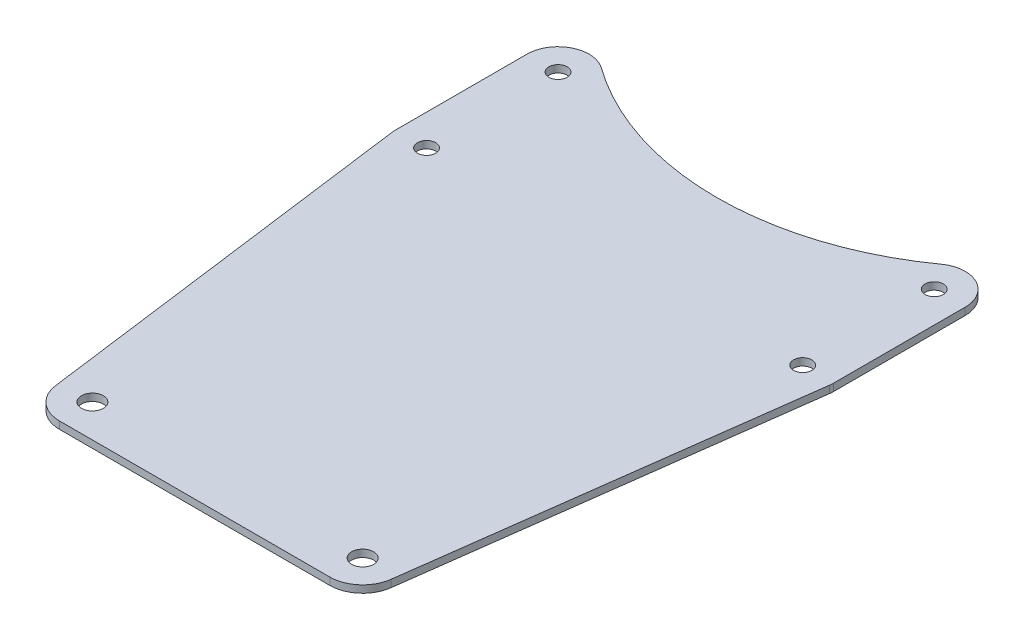
ISO-10303-21;
HEADER;
FILE_DESCRIPTION(('STEP AP214'),'2;1');
FILE_NAME('part.step','',(''),(''),'','','');
FILE_SCHEMA(('AUTOMOTIVE_DESIGN { 1 0 10303 214 1 1 1 1 }'));
ENDSEC;
DATA;
#1=APPLICATION_CONTEXT('core data for automotive mechanical design processes');
#2=APPLICATION_PROTOCOL_DEFINITION('international standard','automotive_design',2000,#1);
#3=PRODUCT_CONTEXT('',#1,'mechanical');
#4=PRODUCT('Part','Part','',(#3));
#5=PRODUCT_RELATED_PRODUCT_CATEGORY('part','',(#4));
#6=PRODUCT_DEFINITION_FORMATION('','',#4);
#7=PRODUCT_DEFINITION_CONTEXT('part definition',#1,'design');
#8=PRODUCT_DEFINITION('design','',#6,#7);
#9=PRODUCT_DEFINITION_SHAPE('','',#8);
#10=(LENGTH_UNIT() NAMED_UNIT(*) SI_UNIT(.MILLI.,.METRE.));
#11=(NAMED_UNIT(*) PLANE_ANGLE_UNIT() SI_UNIT($,.RADIAN.));
#12=(NAMED_UNIT(*) SI_UNIT($,.STERADIAN.) SOLID_ANGLE_UNIT());
#13=UNCERTAINTY_MEASURE_WITH_UNIT(LENGTH_MEASURE(1.E-05),#10,'distance_accuracy_value','');
#14=(GEOMETRIC_REPRESENTATION_CONTEXT(3) GLOBAL_UNCERTAINTY_ASSIGNED_CONTEXT((#13)) GLOBAL_UNIT_ASSIGNED_CONTEXT((#10,
#11,#12)) REPRESENTATION_CONTEXT('',''));
#15=CARTESIAN_POINT('',(0.,0.,0.));
#16=DIRECTION('',(0.,0.,1.));
#17=DIRECTION('',(1.,0.,0.));
#18=AXIS2_PLACEMENT_3D('',#15,#16,#17);
#19=CARTESIAN_POINT('',(-18.5,0.5,62.));
#20=DIRECTION('',(0.,1.,0.));
#21=DIRECTION('',(0.,0.,1.));
#22=AXIS2_PLACEMENT_3D('',#19,#20,#21);
#23=PLANE('',#22);
#24=CARTESIAN_POINT('',(18.5,0.5,62.));
#25=DIRECTION('',(0.,1.,0.));
#26=DIRECTION('',(0.,0.,1.));
#27=AXIS2_PLACEMENT_3D('',#24,#25,#26);
#28=CIRCLE('',#27,1.5);
#29=CARTESIAN_POINT('',(18.5,0.5,63.5));
#30=VERTEX_POINT('',#29);
#31=EDGE_CURVE('E300',#30,#30,#28,.T.);
#32=ORIENTED_EDGE('',*,*,#31,.F.);
#33=EDGE_LOOP('',(#32));
#34=FACE_BOUND('',#33,.T.);
#35=CARTESIAN_POINT('',(25.75,0.5,-9.));
#36=DIRECTION('',(0.,1.,0.));
#37=DIRECTION('',(0.,0.,1.));
#38=AXIS2_PLACEMENT_3D('',#35,#36,#37);
#39=CIRCLE('',#38,1.25);
#40=CARTESIAN_POINT('',(25.75,0.5,-7.75));
#41=VERTEX_POINT('',#40);
#42=EDGE_CURVE('E312',#41,#41,#39,.T.);
#43=ORIENTED_EDGE('',*,*,#42,.F.);
#44=EDGE_LOOP('',(#43));
#45=FACE_BOUND('',#44,.T.);
#46=CARTESIAN_POINT('',(-18.5,0.5,62.));
#47=DIRECTION('',(0.,1.,0.));
#48=DIRECTION('',(0.,0.,1.));
#49=AXIS2_PLACEMENT_3D('',#46,#47,#48);
#50=CIRCLE('',#49,1.5);
#51=CARTESIAN_POINT('',(-18.5,0.5,63.5));
#52=VERTEX_POINT('',#51);
#53=EDGE_CURVE('E158',#52,#52,#50,.T.);
#54=ORIENTED_EDGE('',*,*,#53,.F.);
#55=EDGE_LOOP('',(#54));
#56=FACE_BOUND('',#55,.T.);
#57=CARTESIAN_POINT('',(-18.5,0.5,62.));
#58=DIRECTION('',(0.,1.,0.));
#59=DIRECTION('',(0.,0.,1.));
#60=AXIS2_PLACEMENT_3D('',#57,#58,#59);
#61=CIRCLE('',#60,4.50000000000001);
#62=CARTESIAN_POINT('',(-22.961280999979,0.5,62.5890431556575));
#63=VERTEX_POINT('',#62);
#64=CARTESIAN_POINT('',(-18.5,0.5,66.5));
#65=VERTEX_POINT('',#64);
#66=EDGE_CURVE('E177',#63,#65,#61,.T.);
#67=ORIENTED_EDGE('',*,*,#66,.T.);
#68=DIRECTION('',(1.,0.,0.));
#69=VECTOR('',#68,1.);
#70=CARTESIAN_POINT('',(-18.5,0.5,66.5));
#71=LINE('',#70,#69);
#72=CARTESIAN_POINT('',(18.5,0.5,66.5));
#73=VERTEX_POINT('',#72);
#74=EDGE_CURVE('E105',#65,#73,#71,.T.);
#75=ORIENTED_EDGE('',*,*,#74,.T.);
#76=CARTESIAN_POINT('',(18.5,0.5,62.));
#77=DIRECTION('',(0.,1.,0.));
#78=DIRECTION('',(0.,0.,-1.));
#79=AXIS2_PLACEMENT_3D('',#76,#77,#78);
#80=CIRCLE('',#79,4.50000000000002);
#81=CARTESIAN_POINT('',(22.961280999979,0.5,62.5890431556575));
#82=VERTEX_POINT('',#81);
#83=EDGE_CURVE('E204',#73,#82,#80,.T.);
#84=ORIENTED_EDGE('',*,*,#83,.T.);
#85=DIRECTION('',(0.130898479034999,0.,-0.991395777773097));
#86=VECTOR('',#85,1.);
#87=CARTESIAN_POINT('',(29.9634320555357,0.5,9.55631853589878));
#88=LINE('',#87,#86);
#89=CARTESIAN_POINT('',(29.9634320555357,0.5,9.55631853589878));
#90=VERTEX_POINT('',#89);
#91=EDGE_CURVE('E223',#82,#90,#88,.T.);
#92=ORIENTED_EDGE('',*,*,#91,.T.);
#93=CARTESIAN_POINT('',(25.75,0.5,9.));
#94=DIRECTION('',(0.,1.,0.));
#95=DIRECTION('',(0.,0.,1.));
#96=AXIS2_PLACEMENT_3D('',#93,#94,#95);
#97=CIRCLE('',#96,4.24999999999999);
#98=CARTESIAN_POINT('',(30.,0.5,9.00000000000004));
#99=VERTEX_POINT('',#98);
#100=EDGE_CURVE('E220',#90,#99,#97,.T.);
#101=ORIENTED_EDGE('',*,*,#100,.T.);
#102=DIRECTION('',(0.,0.,-1.));
#103=VECTOR('',#102,1.);
#104=CARTESIAN_POINT('',(30.,0.5,9.00000000000004));
#105=LINE('',#104,#103);
#106=CARTESIAN_POINT('',(30.,0.5,-8.99999999999997));
#107=VERTEX_POINT('',#106);
#108=EDGE_CURVE('E222',#99,#107,#105,.T.);
#109=ORIENTED_EDGE('',*,*,#108,.T.);
#110=CARTESIAN_POINT('',(25.75,0.5,-9.));
#111=DIRECTION('',(0.,1.,0.));
#112=DIRECTION('',(0.,0.,1.));
#113=AXIS2_PLACEMENT_3D('',#110,#111,#112);
#114=CIRCLE('',#113,4.24999999999999);
#115=CARTESIAN_POINT('',(23.2768361581921,0.5,-12.4562929001423));
#116=VERTEX_POINT('',#115);
#117=EDGE_CURVE('E225',#107,#116,#114,.T.);
#118=ORIENTED_EDGE('',*,*,#117,.T.);
#119=CARTESIAN_POINT('',(0.,0.5,-44.9861084308931));
#120=DIRECTION('',(0.,-1.,0.));
#121=DIRECTION('',(0.,0.,-1.));
#122=AXIS2_PLACEMENT_3D('',#119,#120,#121);
#123=CIRCLE('',#122,40.);
#124=CARTESIAN_POINT('',(-23.2768361581921,0.5,-12.4562929001422));
#125=VERTEX_POINT('',#124);
#126=EDGE_CURVE('E231',#116,#125,#123,.T.);
#127=ORIENTED_EDGE('',*,*,#126,.T.);
#128=CARTESIAN_POINT('',(-25.75,0.5,-8.99999999999997));
#129=DIRECTION('',(0.,1.,0.));
#130=DIRECTION('',(0.,0.,-1.));
#131=AXIS2_PLACEMENT_3D('',#128,#129,#130);
#132=CIRCLE('',#131,4.25);
#133=CARTESIAN_POINT('',(-30.,0.5,-8.99999999999997));
#134=VERTEX_POINT('',#133);
#135=EDGE_CURVE('E136',#125,#134,#132,.T.);
#136=ORIENTED_EDGE('',*,*,#135,.T.);
#137=DIRECTION('',(0.,0.,1.));
#138=VECTOR('',#137,1.);
#139=CARTESIAN_POINT('',(-30.,0.5,9.00000000000004));
#140=LINE('',#139,#138);
#141=CARTESIAN_POINT('',(-30.,0.5,9.00000000000004));
#142=VERTEX_POINT('',#141);
#143=EDGE_CURVE('E130',#134,#142,#140,.T.);
#144=ORIENTED_EDGE('',*,*,#143,.T.);
#145=CARTESIAN_POINT('',(-25.75,0.5,9.00000000000004));
#146=DIRECTION('',(0.,1.,0.));
#147=DIRECTION('',(0.,0.,-1.));
#148=AXIS2_PLACEMENT_3D('',#145,#146,#147);
#149=CIRCLE('',#148,4.25);
#150=CARTESIAN_POINT('',(-29.9634320555357,0.5,9.55631853589878));
#151=VERTEX_POINT('',#150);
#152=EDGE_CURVE('E134',#142,#151,#149,.T.);
#153=ORIENTED_EDGE('',*,*,#152,.T.);
#154=DIRECTION('',(0.130898479034999,0.,0.991395777773097));
#155=VECTOR('',#154,1.);
#156=CARTESIAN_POINT('',(-29.9634320555357,0.5,9.55631853589878));
#157=LINE('',#156,#155);
#158=EDGE_CURVE('E50',#151,#63,#157,.T.);
#159=ORIENTED_EDGE('',*,*,#158,.T.);
#160=EDGE_LOOP('',(#67,#75,#84,#92,#101,#109,#118,#127,#136,#144,#153,#159));
#161=FACE_BOUND('',#160,.T.);
#162=CARTESIAN_POINT('',(-25.75,0.5,-8.99999999999997));
#163=DIRECTION('',(0.,1.,0.));
#164=DIRECTION('',(0.,0.,1.));
#165=AXIS2_PLACEMENT_3D('',#162,#163,#164);
#166=CIRCLE('',#165,1.25000000000001);
#167=CARTESIAN_POINT('',(-25.75,0.5,-7.74999999999996));
#168=VERTEX_POINT('',#167);
#169=EDGE_CURVE('E318',#168,#168,#166,.T.);
#170=ORIENTED_EDGE('',*,*,#169,.F.);
#171=EDGE_LOOP('',(#170));
#172=FACE_BOUND('',#171,.T.);
#173=CARTESIAN_POINT('',(25.75,0.5,9.));
#174=DIRECTION('',(0.,1.,0.));
#175=DIRECTION('',(0.,0.,1.));
#176=AXIS2_PLACEMENT_3D('',#173,#174,#175);
#177=CIRCLE('',#176,1.25);
#178=CARTESIAN_POINT('',(25.75,0.5,10.25));
#179=VERTEX_POINT('',#178);
#180=EDGE_CURVE('E306',#179,#179,#177,.T.);
#181=ORIENTED_EDGE('',*,*,#180,.F.);
#182=EDGE_LOOP('',(#181));
#183=FACE_BOUND('',#182,.T.);
#184=CARTESIAN_POINT('',(-25.75,0.5,9.00000000000004));
#185=DIRECTION('',(0.,1.,0.));
#186=DIRECTION('',(0.,0.,1.));
#187=AXIS2_PLACEMENT_3D('',#184,#185,#186);
#188=CIRCLE('',#187,1.25);
#189=CARTESIAN_POINT('',(-25.75,0.5,10.25));
#190=VERTEX_POINT('',#189);
#191=EDGE_CURVE('E291',#190,#190,#188,.T.);
#192=ORIENTED_EDGE('',*,*,#191,.F.);
#193=EDGE_LOOP('',(#192));
#194=FACE_BOUND('',#193,.T.);
#195=ADVANCED_FACE('F33',(#34,#45,#56,#161,#172,#183,#194),#23,.T.);
#196=CARTESIAN_POINT('',(-18.5,-0.5,62.));
#197=DIRECTION('',(0.,1.,0.));
#198=DIRECTION('',(0.,0.,1.));
#199=AXIS2_PLACEMENT_3D('',#196,#197,#198);
#200=PLANE('',#199);
#201=CARTESIAN_POINT('',(18.5,-0.5,62.));
#202=DIRECTION('',(0.,1.,0.));
#203=DIRECTION('',(0.,0.,1.));
#204=AXIS2_PLACEMENT_3D('',#201,#202,#203);
#205=CIRCLE('',#204,1.5);
#206=CARTESIAN_POINT('',(18.5,-0.5,63.5));
#207=VERTEX_POINT('',#206);
#208=EDGE_CURVE('E297',#207,#207,#205,.T.);
#209=ORIENTED_EDGE('',*,*,#208,.T.);
#210=EDGE_LOOP('',(#209));
#211=FACE_BOUND('',#210,.T.);
#212=CARTESIAN_POINT('',(25.75,-0.5,-9.));
#213=DIRECTION('',(0.,1.,0.));
#214=DIRECTION('',(0.,0.,1.));
#215=AXIS2_PLACEMENT_3D('',#212,#213,#214);
#216=CIRCLE('',#215,1.25);
#217=CARTESIAN_POINT('',(25.75,-0.5,-7.75));
#218=VERTEX_POINT('',#217);
#219=EDGE_CURVE('E309',#218,#218,#216,.T.);
#220=ORIENTED_EDGE('',*,*,#219,.T.);
#221=EDGE_LOOP('',(#220));
#222=FACE_BOUND('',#221,.T.);
#223=CARTESIAN_POINT('',(-18.5,-0.5,62.));
#224=DIRECTION('',(0.,1.,0.));
#225=DIRECTION('',(0.,0.,1.));
#226=AXIS2_PLACEMENT_3D('',#223,#224,#225);
#227=CIRCLE('',#226,1.5);
#228=CARTESIAN_POINT('',(-18.5,-0.5,63.5));
#229=VERTEX_POINT('',#228);
#230=EDGE_CURVE('E321',#229,#229,#227,.T.);
#231=ORIENTED_EDGE('',*,*,#230,.T.);
#232=EDGE_LOOP('',(#231));
#233=FACE_BOUND('',#232,.T.);
#234=CARTESIAN_POINT('',(-18.5,-0.5,62.));
#235=DIRECTION('',(0.,1.,0.));
#236=DIRECTION('',(0.,0.,1.));
#237=AXIS2_PLACEMENT_3D('',#234,#235,#236);
#238=CIRCLE('',#237,4.50000000000001);
#239=CARTESIAN_POINT('',(-22.961280999979,-0.5,62.5890431556575));
#240=VERTEX_POINT('',#239);
#241=CARTESIAN_POINT('',(-18.5,-0.5,66.5));
#242=VERTEX_POINT('',#241);
#243=EDGE_CURVE('E154',#240,#242,#238,.T.);
#244=ORIENTED_EDGE('',*,*,#243,.F.);
#245=DIRECTION('',(0.130898479034999,0.,0.991395777773097));
#246=VECTOR('',#245,1.);
#247=CARTESIAN_POINT('',(-29.9634320555357,-0.5,9.55631853589878));
#248=LINE('',#247,#246);
#249=CARTESIAN_POINT('',(-29.9634320555357,-0.5,9.55631853589878));
#250=VERTEX_POINT('',#249);
#251=EDGE_CURVE('E97',#250,#240,#248,.T.);
#252=ORIENTED_EDGE('',*,*,#251,.F.);
#253=CARTESIAN_POINT('',(-25.75,-0.5,9.00000000000004));
#254=DIRECTION('',(0.,1.,0.));
#255=DIRECTION('',(0.,0.,-1.));
#256=AXIS2_PLACEMENT_3D('',#253,#254,#255);
#257=CIRCLE('',#256,4.25);
#258=CARTESIAN_POINT('',(-30.,-0.5,9.00000000000004));
#259=VERTEX_POINT('',#258);
#260=EDGE_CURVE('E91',#259,#250,#257,.T.);
#261=ORIENTED_EDGE('',*,*,#260,.F.);
#262=DIRECTION('',(0.,0.,1.));
#263=VECTOR('',#262,1.);
#264=CARTESIAN_POINT('',(-30.,-0.5,9.00000000000004));
#265=LINE('',#264,#263);
#266=CARTESIAN_POINT('',(-30.,-0.5,-8.99999999999997));
#267=VERTEX_POINT('',#266);
#268=EDGE_CURVE('E144',#267,#259,#265,.T.);
#269=ORIENTED_EDGE('',*,*,#268,.F.);
#270=CARTESIAN_POINT('',(-25.75,-0.5,-8.99999999999997));
#271=DIRECTION('',(0.,1.,0.));
#272=DIRECTION('',(0.,0.,-1.));
#273=AXIS2_PLACEMENT_3D('',#270,#271,#272);
#274=CIRCLE('',#273,4.25);
#275=CARTESIAN_POINT('',(-23.2768361581921,-0.5,-12.4562929001422));
#276=VERTEX_POINT('',#275);
#277=EDGE_CURVE('E172',#276,#267,#274,.T.);
#278=ORIENTED_EDGE('',*,*,#277,.F.);
#279=CARTESIAN_POINT('',(0.,-0.5,-44.9861084308931));
#280=DIRECTION('',(0.,-1.,0.));
#281=DIRECTION('',(0.,0.,-1.));
#282=AXIS2_PLACEMENT_3D('',#279,#280,#281);
#283=CIRCLE('',#282,40.);
#284=CARTESIAN_POINT('',(23.2768361581921,-0.5,-12.4562929001423));
#285=VERTEX_POINT('',#284);
#286=EDGE_CURVE('E170',#285,#276,#283,.T.);
#287=ORIENTED_EDGE('',*,*,#286,.F.);
#288=CARTESIAN_POINT('',(25.75,-0.5,-9.));
#289=DIRECTION('',(0.,1.,0.));
#290=DIRECTION('',(0.,0.,1.));
#291=AXIS2_PLACEMENT_3D('',#288,#289,#290);
#292=CIRCLE('',#291,4.24999999999999);
#293=CARTESIAN_POINT('',(30.,-0.5,-8.99999999999997));
#294=VERTEX_POINT('',#293);
#295=EDGE_CURVE('E168',#294,#285,#292,.T.);
#296=ORIENTED_EDGE('',*,*,#295,.F.);
#297=DIRECTION('',(0.,0.,-1.));
#298=VECTOR('',#297,1.);
#299=CARTESIAN_POINT('',(30.,-0.5,9.00000000000004));
#300=LINE('',#299,#298);
#301=CARTESIAN_POINT('',(30.,-0.5,9.00000000000004));
#302=VERTEX_POINT('',#301);
#303=EDGE_CURVE('E166',#302,#294,#300,.T.);
#304=ORIENTED_EDGE('',*,*,#303,.F.);
#305=CARTESIAN_POINT('',(25.75,-0.5,9.));
#306=DIRECTION('',(0.,1.,0.));
#307=DIRECTION('',(0.,0.,1.));
#308=AXIS2_PLACEMENT_3D('',#305,#306,#307);
#309=CIRCLE('',#308,4.24999999999999);
#310=CARTESIAN_POINT('',(29.9634320555357,-0.5,9.55631853589878));
#311=VERTEX_POINT('',#310);
#312=EDGE_CURVE('E164',#311,#302,#309,.T.);
#313=ORIENTED_EDGE('',*,*,#312,.F.);
#314=DIRECTION('',(0.130898479034999,0.,-0.991395777773097));
#315=VECTOR('',#314,1.);
#316=CARTESIAN_POINT('',(29.9634320555357,-0.5,9.55631853589878));
#317=LINE('',#316,#315);
#318=CARTESIAN_POINT('',(22.961280999979,-0.5,62.5890431556575));
#319=VERTEX_POINT('',#318);
#320=EDGE_CURVE('E162',#319,#311,#317,.T.);
#321=ORIENTED_EDGE('',*,*,#320,.F.);
#322=CARTESIAN_POINT('',(18.5,-0.5,62.));
#323=DIRECTION('',(0.,1.,0.));
#324=DIRECTION('',(0.,0.,-1.));
#325=AXIS2_PLACEMENT_3D('',#322,#323,#324);
#326=CIRCLE('',#325,4.50000000000002);
#327=CARTESIAN_POINT('',(18.5,-0.5,66.5));
#328=VERTEX_POINT('',#327);
#329=EDGE_CURVE('E160',#328,#319,#326,.T.);
#330=ORIENTED_EDGE('',*,*,#329,.F.);
#331=DIRECTION('',(1.,0.,0.));
#332=VECTOR('',#331,1.);
#333=CARTESIAN_POINT('',(-18.5,-0.5,66.5));
#334=LINE('',#333,#332);
#335=EDGE_CURVE('E157',#242,#328,#334,.T.);
#336=ORIENTED_EDGE('',*,*,#335,.F.);
#337=EDGE_LOOP('',(#244,#252,#261,#269,#278,#287,#296,#304,#313,#321,#330,#336));
#338=FACE_BOUND('',#337,.T.);
#339=CARTESIAN_POINT('',(-25.75,-0.5,-8.99999999999997));
#340=DIRECTION('',(0.,1.,0.));
#341=DIRECTION('',(0.,0.,1.));
#342=AXIS2_PLACEMENT_3D('',#339,#340,#341);
#343=CIRCLE('',#342,1.25000000000001);
#344=CARTESIAN_POINT('',(-25.75,-0.5,-7.74999999999996));
#345=VERTEX_POINT('',#344);
#346=EDGE_CURVE('E315',#345,#345,#343,.T.);
#347=ORIENTED_EDGE('',*,*,#346,.T.);
#348=EDGE_LOOP('',(#347));
#349=FACE_BOUND('',#348,.T.);
#350=CARTESIAN_POINT('',(25.75,-0.5,9.));
#351=DIRECTION('',(0.,1.,0.));
#352=DIRECTION('',(0.,0.,1.));
#353=AXIS2_PLACEMENT_3D('',#350,#351,#352);
#354=CIRCLE('',#353,1.25);
#355=CARTESIAN_POINT('',(25.75,-0.5,10.25));
#356=VERTEX_POINT('',#355);
#357=EDGE_CURVE('E303',#356,#356,#354,.T.);
#358=ORIENTED_EDGE('',*,*,#357,.T.);
#359=EDGE_LOOP('',(#358));
#360=FACE_BOUND('',#359,.T.);
#361=CARTESIAN_POINT('',(-25.75,-0.5,9.00000000000004));
#362=DIRECTION('',(0.,1.,0.));
#363=DIRECTION('',(0.,0.,1.));
#364=AXIS2_PLACEMENT_3D('',#361,#362,#363);
#365=CIRCLE('',#364,1.25);
#366=CARTESIAN_POINT('',(-25.75,-0.5,10.25));
#367=VERTEX_POINT('',#366);
#368=EDGE_CURVE('E294',#367,#367,#365,.T.);
#369=ORIENTED_EDGE('',*,*,#368,.T.);
#370=EDGE_LOOP('',(#369));
#371=FACE_BOUND('',#370,.T.);
#372=ADVANCED_FACE('F208',(#211,#222,#233,#338,#349,#360,#371),#200,.F.);
#373=CARTESIAN_POINT('',(-18.5,0.5,62.));
#374=DIRECTION('',(0.,-1.,0.));
#375=DIRECTION('',(0.,0.,-1.));
#376=AXIS2_PLACEMENT_3D('',#373,#374,#375);
#377=CYLINDRICAL_SURFACE('',#376,4.50000000000001);
#378=ORIENTED_EDGE('',*,*,#243,.T.);
#379=DIRECTION('',(0.,-1.,0.));
#380=VECTOR('',#379,1.);
#381=CARTESIAN_POINT('',(-18.5,0.5,66.5));
#382=LINE('',#381,#380);
#383=EDGE_CURVE('E11',#65,#242,#382,.T.);
#384=ORIENTED_EDGE('',*,*,#383,.F.);
#385=ORIENTED_EDGE('',*,*,#66,.F.);
#386=DIRECTION('',(0.,-1.,0.));
#387=VECTOR('',#386,1.);
#388=CARTESIAN_POINT('',(-22.961280999979,0.5,62.5890431556575));
#389=LINE('',#388,#387);
#390=EDGE_CURVE('E150',#63,#240,#389,.T.);
#391=ORIENTED_EDGE('',*,*,#390,.T.);
#392=EDGE_LOOP('',(#378,#384,#385,#391));
#393=FACE_BOUND('',#392,.T.);
#394=ADVANCED_FACE('F35',(#393),#377,.T.);
#395=CARTESIAN_POINT('',(-18.5,0.5,66.5));
#396=DIRECTION('',(0.,0.,-1.));
#397=DIRECTION('',(-1.,0.,0.));
#398=AXIS2_PLACEMENT_3D('',#395,#396,#397);
#399=PLANE('',#398);
#400=ORIENTED_EDGE('',*,*,#335,.T.);
#401=DIRECTION('',(0.,-1.,0.));
#402=VECTOR('',#401,1.);
#403=CARTESIAN_POINT('',(18.5,0.5,66.5));
#404=LINE('',#403,#402);
#405=EDGE_CURVE('E42',#73,#328,#404,.T.);
#406=ORIENTED_EDGE('',*,*,#405,.F.);
#407=ORIENTED_EDGE('',*,*,#74,.F.);
#408=ORIENTED_EDGE('',*,*,#383,.T.);
#409=EDGE_LOOP('',(#400,#406,#407,#408));
#410=FACE_BOUND('',#409,.T.);
#411=ADVANCED_FACE('F448',(#410),#399,.F.);
#412=CARTESIAN_POINT('',(18.5,0.5,62.));
#413=DIRECTION('',(0.,-1.,0.));
#414=DIRECTION('',(0.,0.,-1.));
#415=AXIS2_PLACEMENT_3D('',#412,#413,#414);
#416=CYLINDRICAL_SURFACE('',#415,4.50000000000002);
#417=ORIENTED_EDGE('',*,*,#329,.T.);
#418=DIRECTION('',(0.,-1.,0.));
#419=VECTOR('',#418,1.);
#420=CARTESIAN_POINT('',(22.961280999979,0.5,62.5890431556575));
#421=LINE('',#420,#419);
#422=EDGE_CURVE('E196',#82,#319,#421,.T.);
#423=ORIENTED_EDGE('',*,*,#422,.F.);
#424=ORIENTED_EDGE('',*,*,#83,.F.);
#425=ORIENTED_EDGE('',*,*,#405,.T.);
#426=EDGE_LOOP('',(#417,#423,#424,#425));
#427=FACE_BOUND('',#426,.T.);
#428=ADVANCED_FACE('F202',(#427),#416,.T.);
#429=CARTESIAN_POINT('',(29.9634320555357,0.5,9.55631853589878));
#430=DIRECTION('',(-0.991395777773097,0.,-0.130898479034999));
#431=DIRECTION('',(-0.130898479034999,0.,0.991395777773097));
#432=AXIS2_PLACEMENT_3D('',#429,#430,#431);
#433=PLANE('',#432);
#434=ORIENTED_EDGE('',*,*,#320,.T.);
#435=DIRECTION('',(0.,-1.,0.));
#436=VECTOR('',#435,1.);
#437=CARTESIAN_POINT('',(29.9634320555357,0.5,9.55631853589878));
#438=LINE('',#437,#436);
#439=EDGE_CURVE('E193',#90,#311,#438,.T.);
#440=ORIENTED_EDGE('',*,*,#439,.F.);
#441=ORIENTED_EDGE('',*,*,#91,.F.);
#442=ORIENTED_EDGE('',*,*,#422,.T.);
#443=EDGE_LOOP('',(#434,#440,#441,#442));
#444=FACE_BOUND('',#443,.T.);
#445=ADVANCED_FACE('F214',(#444),#433,.F.);
#446=CARTESIAN_POINT('',(25.75,0.5,9.));
#447=DIRECTION('',(0.,-1.,0.));
#448=DIRECTION('',(0.,0.,-1.));
#449=AXIS2_PLACEMENT_3D('',#446,#447,#448);
#450=CYLINDRICAL_SURFACE('',#449,4.24999999999999);
#451=ORIENTED_EDGE('',*,*,#312,.T.);
#452=DIRECTION('',(0.,-1.,0.));
#453=VECTOR('',#452,1.);
#454=CARTESIAN_POINT('',(30.,0.5,9.00000000000004));
#455=LINE('',#454,#453);
#456=EDGE_CURVE('E190',#99,#302,#455,.T.);
#457=ORIENTED_EDGE('',*,*,#456,.F.);
#458=ORIENTED_EDGE('',*,*,#100,.F.);
#459=ORIENTED_EDGE('',*,*,#439,.T.);
#460=EDGE_LOOP('',(#451,#457,#458,#459));
#461=FACE_BOUND('',#460,.T.);
#462=ADVANCED_FACE('F218',(#461),#450,.T.);
#463=CARTESIAN_POINT('',(30.,0.5,9.00000000000004));
#464=DIRECTION('',(-1.,0.,0.));
#465=DIRECTION('',(0.,0.,1.));
#466=AXIS2_PLACEMENT_3D('',#463,#464,#465);
#467=PLANE('',#466);
#468=ORIENTED_EDGE('',*,*,#303,.T.);
#469=DIRECTION('',(0.,-1.,0.));
#470=VECTOR('',#469,1.);
#471=CARTESIAN_POINT('',(30.,0.5,-8.99999999999997));
#472=LINE('',#471,#470);
#473=EDGE_CURVE('E187',#107,#294,#472,.T.);
#474=ORIENTED_EDGE('',*,*,#473,.F.);
#475=ORIENTED_EDGE('',*,*,#108,.F.);
#476=ORIENTED_EDGE('',*,*,#456,.T.);
#477=EDGE_LOOP('',(#468,#474,#475,#476));
#478=FACE_BOUND('',#477,.T.);
#479=ADVANCED_FACE('F413',(#478),#467,.F.);
#480=CARTESIAN_POINT('',(25.75,0.5,-9.));
#481=DIRECTION('',(0.,-1.,0.));
#482=DIRECTION('',(0.,0.,-1.));
#483=AXIS2_PLACEMENT_3D('',#480,#481,#482);
#484=CYLINDRICAL_SURFACE('',#483,4.24999999999999);
#485=ORIENTED_EDGE('',*,*,#295,.T.);
#486=DIRECTION('',(0.,-1.,0.));
#487=VECTOR('',#486,1.);
#488=CARTESIAN_POINT('',(23.2768361581921,0.5,-12.4562929001423));
#489=LINE('',#488,#487);
#490=EDGE_CURVE('E184',#116,#285,#489,.T.);
#491=ORIENTED_EDGE('',*,*,#490,.F.);
#492=ORIENTED_EDGE('',*,*,#117,.F.);
#493=ORIENTED_EDGE('',*,*,#473,.T.);
#494=EDGE_LOOP('',(#485,#491,#492,#493));
#495=FACE_BOUND('',#494,.T.);
#496=ADVANCED_FACE('F404',(#495),#484,.T.);
#497=CARTESIAN_POINT('',(0.,0.5,-44.9861084308931));
#498=DIRECTION('',(0.,-1.,0.));
#499=DIRECTION('',(0.,0.,-1.));
#500=AXIS2_PLACEMENT_3D('',#497,#498,#499);
#501=CYLINDRICAL_SURFACE('',#500,40.);
#502=ORIENTED_EDGE('',*,*,#286,.T.);
#503=DIRECTION('',(0.,-1.,0.));
#504=VECTOR('',#503,1.);
#505=CARTESIAN_POINT('',(-23.2768361581921,0.5,-12.4562929001422));
#506=LINE('',#505,#504);
#507=EDGE_CURVE('E181',#125,#276,#506,.T.);
#508=ORIENTED_EDGE('',*,*,#507,.F.);
#509=ORIENTED_EDGE('',*,*,#126,.F.);
#510=ORIENTED_EDGE('',*,*,#490,.T.);
#511=EDGE_LOOP('',(#502,#508,#509,#510));
#512=FACE_BOUND('',#511,.T.);
#513=ADVANCED_FACE('F237',(#512),#501,.F.);
#514=CARTESIAN_POINT('',(-25.75,0.5,-8.99999999999997));
#515=DIRECTION('',(0.,-1.,0.));
#516=DIRECTION('',(0.,0.,-1.));
#517=AXIS2_PLACEMENT_3D('',#514,#515,#516);
#518=CYLINDRICAL_SURFACE('',#517,4.25);
#519=ORIENTED_EDGE('',*,*,#277,.T.);
#520=DIRECTION('',(0.,-1.,0.));
#521=VECTOR('',#520,1.);
#522=CARTESIAN_POINT('',(-30.,0.5,-8.99999999999997));
#523=LINE('',#522,#521);
#524=EDGE_CURVE('E145',#134,#267,#523,.T.);
#525=ORIENTED_EDGE('',*,*,#524,.F.);
#526=ORIENTED_EDGE('',*,*,#135,.F.);
#527=ORIENTED_EDGE('',*,*,#507,.T.);
#528=EDGE_LOOP('',(#519,#525,#526,#527));
#529=FACE_BOUND('',#528,.T.);
#530=ADVANCED_FACE('F241',(#529),#518,.T.);
#531=CARTESIAN_POINT('',(-30.,0.5,9.00000000000004));
#532=DIRECTION('',(1.,0.,0.));
#533=DIRECTION('',(0.,0.,-1.));
#534=AXIS2_PLACEMENT_3D('',#531,#532,#533);
#535=PLANE('',#534);
#536=ORIENTED_EDGE('',*,*,#268,.T.);
#537=DIRECTION('',(0.,-1.,0.));
#538=VECTOR('',#537,1.);
#539=CARTESIAN_POINT('',(-30.,0.5,9.00000000000004));
#540=LINE('',#539,#538);
#541=EDGE_CURVE('E141',#142,#259,#540,.T.);
#542=ORIENTED_EDGE('',*,*,#541,.F.);
#543=ORIENTED_EDGE('',*,*,#143,.F.);
#544=ORIENTED_EDGE('',*,*,#524,.T.);
#545=EDGE_LOOP('',(#536,#542,#543,#544));
#546=FACE_BOUND('',#545,.T.);
#547=ADVANCED_FACE('F142',(#546),#535,.F.);
#548=CARTESIAN_POINT('',(-25.75,0.5,9.00000000000004));
#549=DIRECTION('',(0.,-1.,0.));
#550=DIRECTION('',(0.,0.,-1.));
#551=AXIS2_PLACEMENT_3D('',#548,#549,#550);
#552=CYLINDRICAL_SURFACE('',#551,4.25);
#553=ORIENTED_EDGE('',*,*,#260,.T.);
#554=DIRECTION('',(0.,-1.,0.));
#555=VECTOR('',#554,1.);
#556=CARTESIAN_POINT('',(-29.9634320555357,0.5,9.55631853589878));
#557=LINE('',#556,#555);
#558=EDGE_CURVE('E146',#151,#250,#557,.T.);
#559=ORIENTED_EDGE('',*,*,#558,.F.);
#560=ORIENTED_EDGE('',*,*,#152,.F.);
#561=ORIENTED_EDGE('',*,*,#541,.T.);
#562=EDGE_LOOP('',(#553,#559,#560,#561));
#563=FACE_BOUND('',#562,.T.);
#564=ADVANCED_FACE('F148',(#563),#552,.T.);
#565=CARTESIAN_POINT('',(-29.9634320555357,0.5,9.55631853589878));
#566=DIRECTION('',(0.991395777773097,0.,-0.130898479034999));
#567=DIRECTION('',(-0.130898479034999,0.,-0.991395777773097));
#568=AXIS2_PLACEMENT_3D('',#565,#566,#567);
#569=PLANE('',#568);
#570=ORIENTED_EDGE('',*,*,#251,.T.);
#571=ORIENTED_EDGE('',*,*,#390,.F.);
#572=ORIENTED_EDGE('',*,*,#158,.F.);
#573=ORIENTED_EDGE('',*,*,#558,.T.);
#574=EDGE_LOOP('',(#570,#571,#572,#573));
#575=FACE_BOUND('',#574,.T.);
#576=ADVANCED_FACE('F245',(#575),#569,.F.);
#577=CARTESIAN_POINT('',(-18.5,0.5,62.));
#578=DIRECTION('',(0.,-1.,0.));
#579=DIRECTION('',(0.,0.,-1.));
#580=AXIS2_PLACEMENT_3D('',#577,#578,#579);
#581=CYLINDRICAL_SURFACE('',#580,1.5);
#582=ORIENTED_EDGE('',*,*,#53,.T.);
#583=EDGE_LOOP('',(#582));
#584=FACE_BOUND('',#583,.T.);
#585=ORIENTED_EDGE('',*,*,#230,.F.);
#586=EDGE_LOOP('',(#585));
#587=FACE_BOUND('',#586,.T.);
#588=ADVANCED_FACE('F247',(#584,#587),#581,.F.);
#589=CARTESIAN_POINT('',(-25.75,0.5,-8.99999999999997));
#590=DIRECTION('',(0.,-1.,0.));
#591=DIRECTION('',(0.,0.,-1.));
#592=AXIS2_PLACEMENT_3D('',#589,#590,#591);
#593=CYLINDRICAL_SURFACE('',#592,1.25000000000001);
#594=ORIENTED_EDGE('',*,*,#169,.T.);
#595=EDGE_LOOP('',(#594));
#596=FACE_BOUND('',#595,.T.);
#597=ORIENTED_EDGE('',*,*,#346,.F.);
#598=EDGE_LOOP('',(#597));
#599=FACE_BOUND('',#598,.T.);
#600=ADVANCED_FACE('F253',(#596,#599),#593,.F.);
#601=CARTESIAN_POINT('',(25.75,0.5,-9.));
#602=DIRECTION('',(0.,-1.,0.));
#603=DIRECTION('',(0.,0.,-1.));
#604=AXIS2_PLACEMENT_3D('',#601,#602,#603);
#605=CYLINDRICAL_SURFACE('',#604,1.25);
#606=ORIENTED_EDGE('',*,*,#42,.T.);
#607=EDGE_LOOP('',(#606));
#608=FACE_BOUND('',#607,.T.);
#609=ORIENTED_EDGE('',*,*,#219,.F.);
#610=EDGE_LOOP('',(#609));
#611=FACE_BOUND('',#610,.T.);
#612=ADVANCED_FACE('F270',(#608,#611),#605,.F.);
#613=CARTESIAN_POINT('',(25.75,0.5,9.));
#614=DIRECTION('',(0.,-1.,0.));
#615=DIRECTION('',(0.,0.,-1.));
#616=AXIS2_PLACEMENT_3D('',#613,#614,#615);
#617=CYLINDRICAL_SURFACE('',#616,1.25);
#618=ORIENTED_EDGE('',*,*,#180,.T.);
#619=EDGE_LOOP('',(#618));
#620=FACE_BOUND('',#619,.T.);
#621=ORIENTED_EDGE('',*,*,#357,.F.);
#622=EDGE_LOOP('',(#621));
#623=FACE_BOUND('',#622,.T.);
#624=ADVANCED_FACE('F274',(#620,#623),#617,.F.);
#625=CARTESIAN_POINT('',(18.5,0.5,62.));
#626=DIRECTION('',(0.,-1.,0.));
#627=DIRECTION('',(0.,0.,-1.));
#628=AXIS2_PLACEMENT_3D('',#625,#626,#627);
#629=CYLINDRICAL_SURFACE('',#628,1.5);
#630=ORIENTED_EDGE('',*,*,#31,.T.);
#631=EDGE_LOOP('',(#630));
#632=FACE_BOUND('',#631,.T.);
#633=ORIENTED_EDGE('',*,*,#208,.F.);
#634=EDGE_LOOP('',(#633));
#635=FACE_BOUND('',#634,.T.);
#636=ADVANCED_FACE('F278',(#632,#635),#629,.F.);
#637=CARTESIAN_POINT('',(-25.75,0.5,9.00000000000004));
#638=DIRECTION('',(0.,-1.,0.));
#639=DIRECTION('',(0.,0.,-1.));
#640=AXIS2_PLACEMENT_3D('',#637,#638,#639);
#641=CYLINDRICAL_SURFACE('',#640,1.25);
#642=ORIENTED_EDGE('',*,*,#191,.T.);
#643=EDGE_LOOP('',(#642));
#644=FACE_BOUND('',#643,.T.);
#645=ORIENTED_EDGE('',*,*,#368,.F.);
#646=EDGE_LOOP('',(#645));
#647=FACE_BOUND('',#646,.T.);
#648=ADVANCED_FACE('F282',(#644,#647),#641,.F.);
#649=CLOSED_SHELL('',(#195,#372,#394,#411,#428,#445,#462,#479,#496,#513,#530,#547,#564,#576,
#588,#600,#612,#624,#636,#648));
#650=MANIFOLD_SOLID_BREP('B2',#649);
#651=ADVANCED_BREP_SHAPE_REPRESENTATION('',(#18,#650),#14);
#652=SHAPE_DEFINITION_REPRESENTATION(#9,#651);
ENDSEC;
END-ISO-10303-21;
